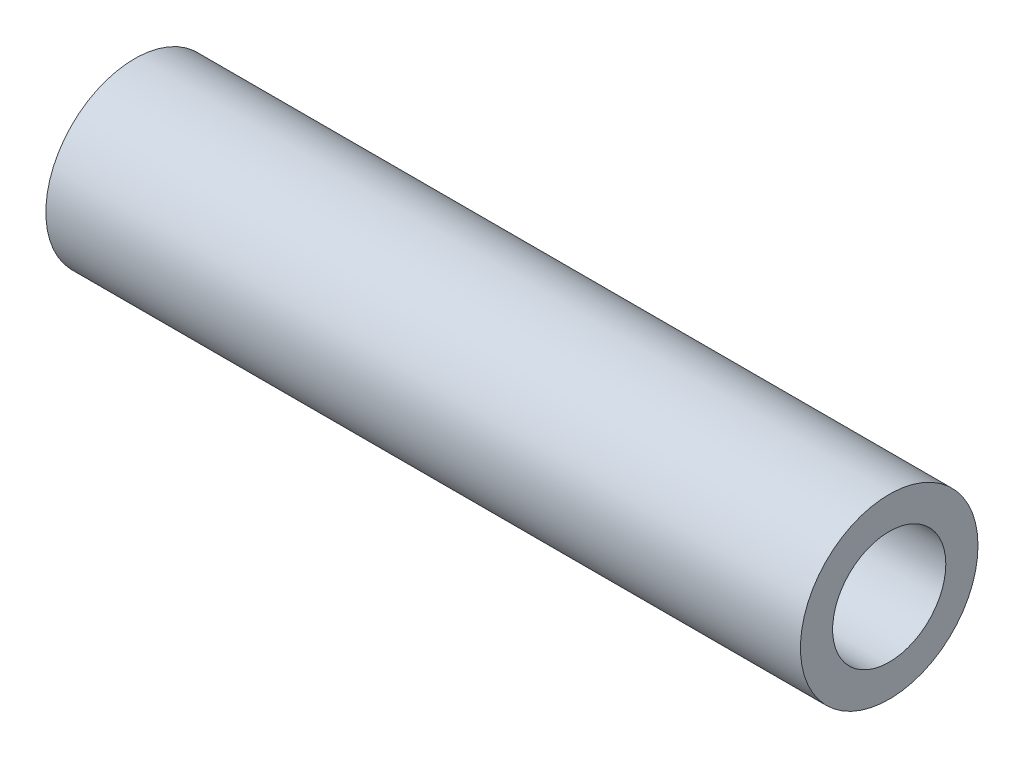
ISO-10303-21;
HEADER;
FILE_DESCRIPTION(('STEP AP214'),'2;1');
FILE_NAME('part.step','',(''),(''),'','','');
FILE_SCHEMA(('AUTOMOTIVE_DESIGN { 1 0 10303 214 1 1 1 1 }'));
ENDSEC;
DATA;
#1=APPLICATION_CONTEXT('core data for automotive mechanical design processes');
#2=APPLICATION_PROTOCOL_DEFINITION('international standard','automotive_design',2000,#1);
#3=PRODUCT_CONTEXT('',#1,'mechanical');
#4=PRODUCT('Part','Part','',(#3));
#5=PRODUCT_RELATED_PRODUCT_CATEGORY('part','',(#4));
#6=PRODUCT_DEFINITION_FORMATION('','',#4);
#7=PRODUCT_DEFINITION_CONTEXT('part definition',#1,'design');
#8=PRODUCT_DEFINITION('design','',#6,#7);
#9=PRODUCT_DEFINITION_SHAPE('','',#8);
#10=(LENGTH_UNIT() NAMED_UNIT(*) SI_UNIT(.MILLI.,.METRE.));
#11=(NAMED_UNIT(*) PLANE_ANGLE_UNIT() SI_UNIT($,.RADIAN.));
#12=(NAMED_UNIT(*) SI_UNIT($,.STERADIAN.) SOLID_ANGLE_UNIT());
#13=UNCERTAINTY_MEASURE_WITH_UNIT(LENGTH_MEASURE(1.E-05),#10,'distance_accuracy_value','');
#14=(GEOMETRIC_REPRESENTATION_CONTEXT(3) GLOBAL_UNCERTAINTY_ASSIGNED_CONTEXT((#13)) GLOBAL_UNIT_ASSIGNED_CONTEXT((#10,
#11,#12)) REPRESENTATION_CONTEXT('',''));
#15=CARTESIAN_POINT('',(0.,0.,0.));
#16=DIRECTION('',(0.,0.,1.));
#17=DIRECTION('',(1.,0.,0.));
#18=AXIS2_PLACEMENT_3D('',#15,#16,#17);
#19=CARTESIAN_POINT('',(34.,0.,0.));
#20=DIRECTION('',(1.,0.,0.));
#21=DIRECTION('',(0.,0.,-1.));
#22=AXIS2_PLACEMENT_3D('',#19,#20,#21);
#23=PLANE('',#22);
#24=CARTESIAN_POINT('',(34.,0.,0.));
#25=DIRECTION('',(1.,0.,0.));
#26=DIRECTION('',(0.,0.,-1.));
#27=AXIS2_PLACEMENT_3D('',#24,#25,#26);
#28=CIRCLE('',#27,4.);
#29=CARTESIAN_POINT('',(34.,0.,-4.));
#30=VERTEX_POINT('',#29);
#31=EDGE_CURVE('E10',#30,#30,#28,.T.);
#32=ORIENTED_EDGE('',*,*,#31,.T.);
#33=EDGE_LOOP('',(#32));
#34=FACE_BOUND('',#33,.T.);
#35=CARTESIAN_POINT('',(34.,0.,0.));
#36=DIRECTION('',(1.,0.,0.));
#37=DIRECTION('',(0.,0.,-1.));
#38=AXIS2_PLACEMENT_3D('',#35,#36,#37);
#39=CIRCLE('',#38,2.55);
#40=CARTESIAN_POINT('',(34.,0.,-2.55));
#41=VERTEX_POINT('',#40);
#42=EDGE_CURVE('E42',#41,#41,#39,.T.);
#43=ORIENTED_EDGE('',*,*,#42,.F.);
#44=EDGE_LOOP('',(#43));
#45=FACE_BOUND('',#44,.T.);
#46=ADVANCED_FACE('F31',(#34,#45),#23,.T.);
#47=CARTESIAN_POINT('',(0.,0.,0.));
#48=DIRECTION('',(1.,0.,0.));
#49=DIRECTION('',(0.,0.,-1.));
#50=AXIS2_PLACEMENT_3D('',#47,#48,#49);
#51=PLANE('',#50);
#52=CARTESIAN_POINT('',(0.,0.,0.));
#53=DIRECTION('',(1.,0.,0.));
#54=DIRECTION('',(0.,0.,-1.));
#55=AXIS2_PLACEMENT_3D('',#52,#53,#54);
#56=CIRCLE('',#55,4.);
#57=CARTESIAN_POINT('',(0.,0.,-4.));
#58=VERTEX_POINT('',#57);
#59=EDGE_CURVE('E35',#58,#58,#56,.T.);
#60=ORIENTED_EDGE('',*,*,#59,.F.);
#61=EDGE_LOOP('',(#60));
#62=FACE_BOUND('',#61,.T.);
#63=CARTESIAN_POINT('',(0.,0.,0.));
#64=DIRECTION('',(1.,0.,0.));
#65=DIRECTION('',(0.,0.,-1.));
#66=AXIS2_PLACEMENT_3D('',#63,#64,#65);
#67=CIRCLE('',#66,2.55);
#68=CARTESIAN_POINT('',(0.,0.,-2.55));
#69=VERTEX_POINT('',#68);
#70=EDGE_CURVE('E44',#69,#69,#67,.T.);
#71=ORIENTED_EDGE('',*,*,#70,.T.);
#72=EDGE_LOOP('',(#71));
#73=FACE_BOUND('',#72,.T.);
#74=ADVANCED_FACE('F54',(#62,#73),#51,.F.);
#75=CARTESIAN_POINT('',(34.,0.,0.));
#76=DIRECTION('',(-1.,0.,0.));
#77=DIRECTION('',(0.,0.,1.));
#78=AXIS2_PLACEMENT_3D('',#75,#76,#77);
#79=CYLINDRICAL_SURFACE('',#78,4.);
#80=ORIENTED_EDGE('',*,*,#31,.F.);
#81=EDGE_LOOP('',(#80));
#82=FACE_BOUND('',#81,.T.);
#83=ORIENTED_EDGE('',*,*,#59,.T.);
#84=EDGE_LOOP('',(#83));
#85=FACE_BOUND('',#84,.T.);
#86=ADVANCED_FACE('F33',(#82,#85),#79,.T.);
#87=CARTESIAN_POINT('',(34.,0.,0.));
#88=DIRECTION('',(-1.,0.,0.));
#89=DIRECTION('',(0.,0.,1.));
#90=AXIS2_PLACEMENT_3D('',#87,#88,#89);
#91=CYLINDRICAL_SURFACE('',#90,2.55);
#92=ORIENTED_EDGE('',*,*,#42,.T.);
#93=EDGE_LOOP('',(#92));
#94=FACE_BOUND('',#93,.T.);
#95=ORIENTED_EDGE('',*,*,#70,.F.);
#96=EDGE_LOOP('',(#95));
#97=FACE_BOUND('',#96,.T.);
#98=ADVANCED_FACE('F50',(#94,#97),#91,.F.);
#99=CLOSED_SHELL('',(#46,#74,#86,#98));
#100=MANIFOLD_SOLID_BREP('B2',#99);
#101=ADVANCED_BREP_SHAPE_REPRESENTATION('',(#18,#100),#14);
#102=SHAPE_DEFINITION_REPRESENTATION(#9,#101);
ENDSEC;
END-ISO-10303-21;
